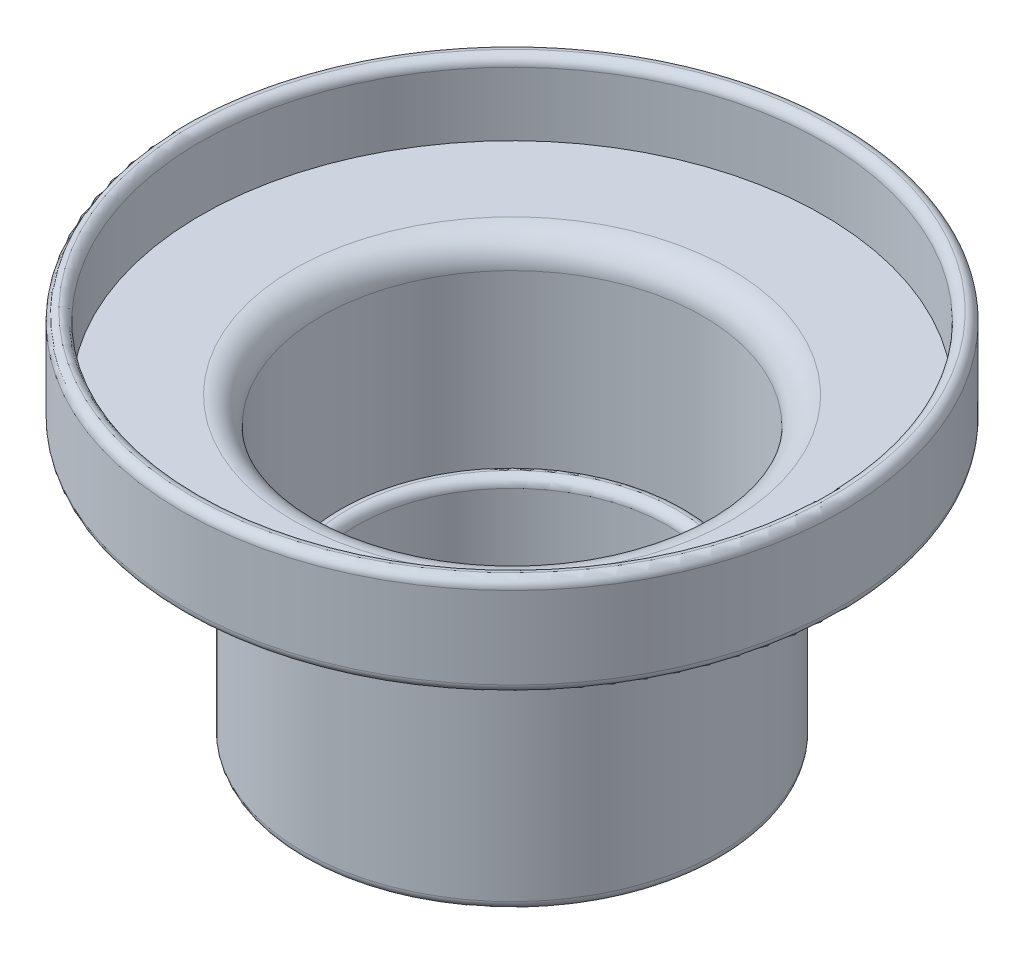
ISO-10303-21;
HEADER;
FILE_DESCRIPTION(('STEP AP214'),'2;1');
FILE_NAME('part.step','',(''),(''),'','','');
FILE_SCHEMA(('AUTOMOTIVE_DESIGN { 1 0 10303 214 1 1 1 1 }'));
ENDSEC;
DATA;
#1=APPLICATION_CONTEXT('core data for automotive mechanical design processes');
#2=APPLICATION_PROTOCOL_DEFINITION('international standard','automotive_design',2000,#1);
#3=PRODUCT_CONTEXT('',#1,'mechanical');
#4=PRODUCT('Part','Part','',(#3));
#5=PRODUCT_RELATED_PRODUCT_CATEGORY('part','',(#4));
#6=PRODUCT_DEFINITION_FORMATION('','',#4);
#7=PRODUCT_DEFINITION_CONTEXT('part definition',#1,'design');
#8=PRODUCT_DEFINITION('design','',#6,#7);
#9=PRODUCT_DEFINITION_SHAPE('','',#8);
#10=(LENGTH_UNIT() NAMED_UNIT(*) SI_UNIT(.MILLI.,.METRE.));
#11=(NAMED_UNIT(*) PLANE_ANGLE_UNIT() SI_UNIT($,.RADIAN.));
#12=(NAMED_UNIT(*) SI_UNIT($,.STERADIAN.) SOLID_ANGLE_UNIT());
#13=UNCERTAINTY_MEASURE_WITH_UNIT(LENGTH_MEASURE(1.E-05),#10,'distance_accuracy_value','');
#14=(GEOMETRIC_REPRESENTATION_CONTEXT(3) GLOBAL_UNCERTAINTY_ASSIGNED_CONTEXT((#13)) GLOBAL_UNIT_ASSIGNED_CONTEXT((#10,
#11,#12)) REPRESENTATION_CONTEXT('',''));
#15=CARTESIAN_POINT('',(0.,0.,0.));
#16=DIRECTION('',(0.,0.,1.));
#17=DIRECTION('',(1.,0.,0.));
#18=AXIS2_PLACEMENT_3D('',#15,#16,#17);
#19=CARTESIAN_POINT('',(0.,-3.,0.));
#20=DIRECTION('',(0.,1.,0.));
#21=DIRECTION('',(0.,0.,1.));
#22=AXIS2_PLACEMENT_3D('',#19,#20,#21);
#23=CYLINDRICAL_SURFACE('',#22,23.);
#24=CARTESIAN_POINT('',(0.,-2.,0.));
#25=DIRECTION('',(0.,1.,0.));
#26=DIRECTION('',(0.,0.,1.));
#27=AXIS2_PLACEMENT_3D('',#24,#25,#26);
#28=CIRCLE('',#27,23.);
#29=CARTESIAN_POINT('',(0.,-2.,23.));
#30=VERTEX_POINT('',#29);
#31=EDGE_CURVE('E50',#30,#30,#28,.T.);
#32=ORIENTED_EDGE('',*,*,#31,.T.);
#33=EDGE_LOOP('',(#32));
#34=FACE_BOUND('',#33,.T.);
#35=CARTESIAN_POINT('',(0.,22.,0.));
#36=DIRECTION('',(0.,1.,0.));
#37=DIRECTION('',(0.,0.,1.));
#38=AXIS2_PLACEMENT_3D('',#35,#36,#37);
#39=CIRCLE('',#38,23.);
#40=CARTESIAN_POINT('',(0.,22.,23.));
#41=VERTEX_POINT('',#40);
#42=EDGE_CURVE('E157',#41,#41,#39,.F.);
#43=ORIENTED_EDGE('',*,*,#42,.T.);
#44=EDGE_LOOP('',(#43));
#45=FACE_BOUND('',#44,.T.);
#46=ADVANCED_FACE('F37',(#34,#45),#23,.T.);
#47=CARTESIAN_POINT('',(0.,0.,0.));
#48=DIRECTION('',(0.,1.,0.));
#49=DIRECTION('',(0.,0.,1.));
#50=AXIS2_PLACEMENT_3D('',#47,#48,#49);
#51=PLANE('',#50);
#52=CARTESIAN_POINT('',(0.,0.,0.));
#53=DIRECTION('',(0.,1.,0.));
#54=DIRECTION('',(0.,0.,1.));
#55=AXIS2_PLACEMENT_3D('',#52,#53,#54);
#56=CIRCLE('',#55,19.125);
#57=CARTESIAN_POINT('',(0.,0.,19.125));
#58=VERTEX_POINT('',#57);
#59=EDGE_CURVE('E55',#58,#58,#56,.T.);
#60=ORIENTED_EDGE('',*,*,#59,.F.);
#61=EDGE_LOOP('',(#60));
#62=FACE_BOUND('',#61,.T.);
#63=CARTESIAN_POINT('',(0.,0.,0.));
#64=DIRECTION('',(0.,1.,0.));
#65=DIRECTION('',(0.,0.,1.));
#66=AXIS2_PLACEMENT_3D('',#63,#64,#65);
#67=CIRCLE('',#66,21.);
#68=CARTESIAN_POINT('',(0.,0.,21.));
#69=VERTEX_POINT('',#68);
#70=EDGE_CURVE('E59',#69,#69,#67,.F.);
#71=ORIENTED_EDGE('',*,*,#70,.F.);
#72=EDGE_LOOP('',(#71));
#73=FACE_BOUND('',#72,.T.);
#74=ADVANCED_FACE('F78',(#62,#73),#51,.T.);
#75=CARTESIAN_POINT('',(0.,64.0936687607709,0.));
#76=DIRECTION('',(0.,-1.,0.));
#77=DIRECTION('',(0.,0.,-1.));
#78=AXIS2_PLACEMENT_3D('',#75,#76,#77);
#79=CYLINDRICAL_SURFACE('',#78,19.125);
#80=CARTESIAN_POINT('',(0.,9.,0.));
#81=DIRECTION('',(0.,1.,0.));
#82=DIRECTION('',(0.,0.,1.));
#83=AXIS2_PLACEMENT_3D('',#80,#81,#82);
#84=CIRCLE('',#83,19.125);
#85=CARTESIAN_POINT('',(0.,9.,19.125));
#86=VERTEX_POINT('',#85);
#87=EDGE_CURVE('E10',#86,#86,#84,.F.);
#88=ORIENTED_EDGE('',*,*,#87,.T.);
#89=EDGE_LOOP('',(#88));
#90=FACE_BOUND('',#89,.T.);
#91=ORIENTED_EDGE('',*,*,#59,.T.);
#92=EDGE_LOOP('',(#91));
#93=FACE_BOUND('',#92,.T.);
#94=ADVANCED_FACE('F84',(#90,#93),#79,.T.);
#95=CARTESIAN_POINT('',(0.,64.0936687607709,0.));
#96=DIRECTION('',(0.,-1.,0.));
#97=DIRECTION('',(0.,0.,-1.));
#98=AXIS2_PLACEMENT_3D('',#95,#96,#97);
#99=CYLINDRICAL_SURFACE('',#98,17.125);
#100=CARTESIAN_POINT('',(0.,-2.,0.));
#101=DIRECTION('',(0.,1.,0.));
#102=DIRECTION('',(0.,0.,1.));
#103=AXIS2_PLACEMENT_3D('',#100,#101,#102);
#104=CIRCLE('',#103,17.125);
#105=CARTESIAN_POINT('',(0.,-2.,17.125));
#106=VERTEX_POINT('',#105);
#107=EDGE_CURVE('E128',#106,#106,#104,.F.);
#108=ORIENTED_EDGE('',*,*,#107,.T.);
#109=EDGE_LOOP('',(#108));
#110=FACE_BOUND('',#109,.T.);
#111=CARTESIAN_POINT('',(0.,9.,0.));
#112=DIRECTION('',(0.,1.,0.));
#113=DIRECTION('',(0.,0.,1.));
#114=AXIS2_PLACEMENT_3D('',#111,#112,#113);
#115=CIRCLE('',#114,17.125);
#116=CARTESIAN_POINT('',(0.,9.,17.125));
#117=VERTEX_POINT('',#116);
#118=EDGE_CURVE('E130',#117,#117,#115,.T.);
#119=ORIENTED_EDGE('',*,*,#118,.T.);
#120=EDGE_LOOP('',(#119));
#121=FACE_BOUND('',#120,.T.);
#122=ADVANCED_FACE('F91',(#110,#121),#99,.F.);
#123=CARTESIAN_POINT('',(0.,-3.,0.));
#124=DIRECTION('',(0.,1.,0.));
#125=DIRECTION('',(0.,0.,1.));
#126=AXIS2_PLACEMENT_3D('',#123,#124,#125);
#127=PLANE('',#126);
#128=CARTESIAN_POINT('',(0.,-3.,0.));
#129=DIRECTION('',(0.,1.,0.));
#130=DIRECTION('',(0.,0.,1.));
#131=AXIS2_PLACEMENT_3D('',#128,#129,#130);
#132=CIRCLE('',#131,18.125);
#133=CARTESIAN_POINT('',(0.,-3.,18.125));
#134=VERTEX_POINT('',#133);
#135=EDGE_CURVE('E135',#134,#134,#132,.T.);
#136=ORIENTED_EDGE('',*,*,#135,.T.);
#137=EDGE_LOOP('',(#136));
#138=FACE_BOUND('',#137,.T.);
#139=CARTESIAN_POINT('',(0.,-3.,0.));
#140=DIRECTION('',(0.,1.,0.));
#141=DIRECTION('',(0.,0.,1.));
#142=AXIS2_PLACEMENT_3D('',#139,#140,#141);
#143=CIRCLE('',#142,22.);
#144=CARTESIAN_POINT('',(0.,-3.,22.));
#145=VERTEX_POINT('',#144);
#146=EDGE_CURVE('E126',#145,#145,#143,.F.);
#147=ORIENTED_EDGE('',*,*,#146,.T.);
#148=EDGE_LOOP('',(#147));
#149=FACE_BOUND('',#148,.T.);
#150=ADVANCED_FACE('F94',(#138,#149),#127,.F.);
#151=CARTESIAN_POINT('',(0.,95.0538238691624,0.));
#152=DIRECTION('',(0.,-1.,0.));
#153=DIRECTION('',(0.,0.,-1.));
#154=AXIS2_PLACEMENT_3D('',#151,#152,#153);
#155=CYLINDRICAL_SURFACE('',#154,21.);
#156=CARTESIAN_POINT('',(0.,27.,0.));
#157=DIRECTION('',(0.,1.,0.));
#158=DIRECTION('',(0.,0.,1.));
#159=AXIS2_PLACEMENT_3D('',#156,#157,#158);
#160=CIRCLE('',#159,21.);
#161=CARTESIAN_POINT('',(0.,27.,21.));
#162=VERTEX_POINT('',#161);
#163=EDGE_CURVE('E151',#162,#162,#160,.T.);
#164=ORIENTED_EDGE('',*,*,#163,.T.);
#165=EDGE_LOOP('',(#164));
#166=FACE_BOUND('',#165,.T.);
#167=ORIENTED_EDGE('',*,*,#70,.T.);
#168=EDGE_LOOP('',(#167));
#169=FACE_BOUND('',#168,.T.);
#170=ADVANCED_FACE('F166',(#166,#169),#155,.F.);
#171=CARTESIAN_POINT('',(0.,30.,0.));
#172=DIRECTION('',(0.,1.,0.));
#173=DIRECTION('',(0.,0.,1.));
#174=AXIS2_PLACEMENT_3D('',#171,#172,#173);
#175=PLANE('',#174);
#176=CARTESIAN_POINT('',(0.,30.,0.));
#177=DIRECTION('',(0.,1.,0.));
#178=DIRECTION('',(0.,0.,1.));
#179=AXIS2_PLACEMENT_3D('',#176,#177,#178);
#180=CIRCLE('',#179,24.);
#181=CARTESIAN_POINT('',(0.,30.,24.));
#182=VERTEX_POINT('',#181);
#183=EDGE_CURVE('E148',#182,#182,#180,.F.);
#184=ORIENTED_EDGE('',*,*,#183,.T.);
#185=EDGE_LOOP('',(#184));
#186=FACE_BOUND('',#185,.T.);
#187=CARTESIAN_POINT('',(0.,30.,0.));
#188=DIRECTION('',(0.,1.,0.));
#189=DIRECTION('',(0.,0.,1.));
#190=AXIS2_PLACEMENT_3D('',#187,#188,#189);
#191=CIRCLE('',#190,34.25);
#192=CARTESIAN_POINT('',(0.,30.,34.25));
#193=VERTEX_POINT('',#192);
#194=EDGE_CURVE('E160',#193,#193,#191,.F.);
#195=ORIENTED_EDGE('',*,*,#194,.F.);
#196=EDGE_LOOP('',(#195));
#197=FACE_BOUND('',#196,.T.);
#198=ADVANCED_FACE('F169',(#186,#197),#175,.T.);
#199=CARTESIAN_POINT('',(0.,27.,0.));
#200=DIRECTION('',(0.,1.,0.));
#201=DIRECTION('',(0.,0.,1.));
#202=AXIS2_PLACEMENT_3D('',#199,#200,#201);
#203=CYLINDRICAL_SURFACE('',#202,36.25);
#204=CARTESIAN_POINT('',(0.,37.,0.));
#205=DIRECTION('',(0.,1.,0.));
#206=DIRECTION('',(0.,0.,1.));
#207=AXIS2_PLACEMENT_3D('',#204,#205,#206);
#208=CIRCLE('',#207,36.25);
#209=CARTESIAN_POINT('',(0.,37.,36.25));
#210=VERTEX_POINT('',#209);
#211=EDGE_CURVE('E142',#210,#210,#208,.F.);
#212=ORIENTED_EDGE('',*,*,#211,.T.);
#213=EDGE_LOOP('',(#212));
#214=FACE_BOUND('',#213,.T.);
#215=CARTESIAN_POINT('',(0.,28.,0.));
#216=DIRECTION('',(0.,1.,0.));
#217=DIRECTION('',(0.,0.,1.));
#218=AXIS2_PLACEMENT_3D('',#215,#216,#217);
#219=CIRCLE('',#218,36.25);
#220=CARTESIAN_POINT('',(0.,28.,36.25));
#221=VERTEX_POINT('',#220);
#222=EDGE_CURVE('E145',#221,#221,#219,.T.);
#223=ORIENTED_EDGE('',*,*,#222,.T.);
#224=EDGE_LOOP('',(#223));
#225=FACE_BOUND('',#224,.T.);
#226=ADVANCED_FACE('F176',(#214,#225),#203,.T.);
#227=CARTESIAN_POINT('',(0.,27.,0.));
#228=DIRECTION('',(0.,1.,0.));
#229=DIRECTION('',(0.,0.,1.));
#230=AXIS2_PLACEMENT_3D('',#227,#228,#229);
#231=PLANE('',#230);
#232=CARTESIAN_POINT('',(0.,27.,0.));
#233=DIRECTION('',(0.,1.,0.));
#234=DIRECTION('',(0.,0.,1.));
#235=AXIS2_PLACEMENT_3D('',#232,#233,#234);
#236=CIRCLE('',#235,35.25);
#237=CARTESIAN_POINT('',(0.,27.,35.25));
#238=VERTEX_POINT('',#237);
#239=EDGE_CURVE('E45',#238,#238,#236,.F.);
#240=ORIENTED_EDGE('',*,*,#239,.T.);
#241=EDGE_LOOP('',(#240));
#242=FACE_BOUND('',#241,.T.);
#243=CARTESIAN_POINT('',(0.,27.,0.));
#244=DIRECTION('',(0.,1.,0.));
#245=DIRECTION('',(0.,0.,1.));
#246=AXIS2_PLACEMENT_3D('',#243,#244,#245);
#247=CIRCLE('',#246,28.);
#248=CARTESIAN_POINT('',(0.,27.,28.));
#249=VERTEX_POINT('',#248);
#250=EDGE_CURVE('E154',#249,#249,#247,.T.);
#251=ORIENTED_EDGE('',*,*,#250,.T.);
#252=EDGE_LOOP('',(#251));
#253=FACE_BOUND('',#252,.T.);
#254=ADVANCED_FACE('F183',(#242,#253),#231,.F.);
#255=CARTESIAN_POINT('',(0.,38.,0.));
#256=DIRECTION('',(0.,-1.,0.));
#257=DIRECTION('',(0.,0.,-1.));
#258=AXIS2_PLACEMENT_3D('',#255,#256,#257);
#259=CYLINDRICAL_SURFACE('',#258,34.25);
#260=CARTESIAN_POINT('',(0.,37.,0.));
#261=DIRECTION('',(0.,1.,0.));
#262=DIRECTION('',(0.,0.,1.));
#263=AXIS2_PLACEMENT_3D('',#260,#261,#262);
#264=CIRCLE('',#263,34.25);
#265=CARTESIAN_POINT('',(0.,37.,34.25));
#266=VERTEX_POINT('',#265);
#267=EDGE_CURVE('E139',#266,#266,#264,.T.);
#268=ORIENTED_EDGE('',*,*,#267,.T.);
#269=EDGE_LOOP('',(#268));
#270=FACE_BOUND('',#269,.T.);
#271=ORIENTED_EDGE('',*,*,#194,.T.);
#272=EDGE_LOOP('',(#271));
#273=FACE_BOUND('',#272,.T.);
#274=ADVANCED_FACE('F102',(#270,#273),#259,.F.);
#275=CARTESIAN_POINT('',(0.,22.,0.));
#276=DIRECTION('',(0.,1.,0.));
#277=DIRECTION('',(0.,0.,1.));
#278=AXIS2_PLACEMENT_3D('',#275,#276,#277);
#279=TOROIDAL_SURFACE('',#278,28.,5.);
#280=ORIENTED_EDGE('',*,*,#250,.F.);
#281=EDGE_LOOP('',(#280));
#282=FACE_BOUND('',#281,.T.);
#283=ORIENTED_EDGE('',*,*,#42,.F.);
#284=EDGE_LOOP('',(#283));
#285=FACE_BOUND('',#284,.T.);
#286=ADVANCED_FACE('F98',(#282,#285),#279,.F.);
#287=CARTESIAN_POINT('',(0.,27.,0.));
#288=DIRECTION('',(0.,1.,0.));
#289=DIRECTION('',(0.,0.,1.));
#290=AXIS2_PLACEMENT_3D('',#287,#288,#289);
#291=TOROIDAL_SURFACE('',#290,24.,3.);
#292=ORIENTED_EDGE('',*,*,#183,.F.);
#293=EDGE_LOOP('',(#292));
#294=FACE_BOUND('',#293,.T.);
#295=ORIENTED_EDGE('',*,*,#163,.F.);
#296=EDGE_LOOP('',(#295));
#297=FACE_BOUND('',#296,.T.);
#298=ADVANCED_FACE('F101',(#294,#297),#291,.T.);
#299=CARTESIAN_POINT('',(0.,37.,0.));
#300=DIRECTION('',(0.,1.,0.));
#301=DIRECTION('',(0.,0.,1.));
#302=AXIS2_PLACEMENT_3D('',#299,#300,#301);
#303=TOROIDAL_SURFACE('',#302,35.25,1.);
#304=ORIENTED_EDGE('',*,*,#267,.F.);
#305=EDGE_LOOP('',(#304));
#306=FACE_BOUND('',#305,.T.);
#307=CARTESIAN_POINT('',(0.,38.,0.));
#308=DIRECTION('',(0.,1.,0.));
#309=DIRECTION('',(0.,0.,1.));
#310=AXIS2_PLACEMENT_3D('',#307,#308,#309);
#311=CIRCLE('',#310,35.25);
#312=CARTESIAN_POINT('',(0.,38.,35.25));
#313=VERTEX_POINT('',#312);
#314=EDGE_CURVE('E53',#313,#313,#311,.F.);
#315=ORIENTED_EDGE('',*,*,#314,.F.);
#316=EDGE_LOOP('',(#315));
#317=FACE_BOUND('',#316,.T.);
#318=ADVANCED_FACE('F106',(#306,#317),#303,.T.);
#319=CARTESIAN_POINT('',(0.,37.,0.));
#320=DIRECTION('',(0.,1.,0.));
#321=DIRECTION('',(0.,0.,1.));
#322=AXIS2_PLACEMENT_3D('',#319,#320,#321);
#323=TOROIDAL_SURFACE('',#322,35.25,1.);
#324=ORIENTED_EDGE('',*,*,#211,.F.);
#325=EDGE_LOOP('',(#324));
#326=FACE_BOUND('',#325,.T.);
#327=ORIENTED_EDGE('',*,*,#314,.T.);
#328=EDGE_LOOP('',(#327));
#329=FACE_BOUND('',#328,.T.);
#330=ADVANCED_FACE('F108',(#326,#329),#323,.T.);
#331=CARTESIAN_POINT('',(0.,-2.,0.));
#332=DIRECTION('',(0.,1.,0.));
#333=DIRECTION('',(0.,0.,1.));
#334=AXIS2_PLACEMENT_3D('',#331,#332,#333);
#335=TOROIDAL_SURFACE('',#334,18.125,1.);
#336=ORIENTED_EDGE('',*,*,#107,.F.);
#337=EDGE_LOOP('',(#336));
#338=FACE_BOUND('',#337,.T.);
#339=ORIENTED_EDGE('',*,*,#135,.F.);
#340=EDGE_LOOP('',(#339));
#341=FACE_BOUND('',#340,.T.);
#342=ADVANCED_FACE('F111',(#338,#341),#335,.T.);
#343=CARTESIAN_POINT('',(0.,-2.,0.));
#344=DIRECTION('',(0.,1.,0.));
#345=DIRECTION('',(0.,0.,1.));
#346=AXIS2_PLACEMENT_3D('',#343,#344,#345);
#347=TOROIDAL_SURFACE('',#346,22.,1.);
#348=ORIENTED_EDGE('',*,*,#146,.F.);
#349=EDGE_LOOP('',(#348));
#350=FACE_BOUND('',#349,.T.);
#351=ORIENTED_EDGE('',*,*,#31,.F.);
#352=EDGE_LOOP('',(#351));
#353=FACE_BOUND('',#352,.T.);
#354=ADVANCED_FACE('F74',(#350,#353),#347,.T.);
#355=CARTESIAN_POINT('',(0.,28.,0.));
#356=DIRECTION('',(0.,1.,0.));
#357=DIRECTION('',(0.,0.,1.));
#358=AXIS2_PLACEMENT_3D('',#355,#356,#357);
#359=TOROIDAL_SURFACE('',#358,35.25,1.);
#360=ORIENTED_EDGE('',*,*,#239,.F.);
#361=EDGE_LOOP('',(#360));
#362=FACE_BOUND('',#361,.T.);
#363=ORIENTED_EDGE('',*,*,#222,.F.);
#364=EDGE_LOOP('',(#363));
#365=FACE_BOUND('',#364,.T.);
#366=ADVANCED_FACE('F68',(#362,#365),#359,.T.);
#367=CARTESIAN_POINT('',(0.,9.,0.));
#368=DIRECTION('',(0.,1.,0.));
#369=DIRECTION('',(0.,0.,1.));
#370=AXIS2_PLACEMENT_3D('',#367,#368,#369);
#371=TOROIDAL_SURFACE('',#370,18.125,1.);
#372=ORIENTED_EDGE('',*,*,#87,.F.);
#373=EDGE_LOOP('',(#372));
#374=FACE_BOUND('',#373,.T.);
#375=CARTESIAN_POINT('',(0.,10.,0.));
#376=DIRECTION('',(0.,1.,0.));
#377=DIRECTION('',(0.,0.,1.));
#378=AXIS2_PLACEMENT_3D('',#375,#376,#377);
#379=CIRCLE('',#378,18.125);
#380=CARTESIAN_POINT('',(0.,10.,18.125));
#381=VERTEX_POINT('',#380);
#382=EDGE_CURVE('E41',#381,#381,#379,.T.);
#383=ORIENTED_EDGE('',*,*,#382,.F.);
#384=EDGE_LOOP('',(#383));
#385=FACE_BOUND('',#384,.T.);
#386=ADVANCED_FACE('F39',(#374,#385),#371,.T.);
#387=CARTESIAN_POINT('',(0.,9.,0.));
#388=DIRECTION('',(0.,1.,0.));
#389=DIRECTION('',(0.,0.,1.));
#390=AXIS2_PLACEMENT_3D('',#387,#388,#389);
#391=TOROIDAL_SURFACE('',#390,18.125,1.);
#392=ORIENTED_EDGE('',*,*,#382,.T.);
#393=EDGE_LOOP('',(#392));
#394=FACE_BOUND('',#393,.T.);
#395=ORIENTED_EDGE('',*,*,#118,.F.);
#396=EDGE_LOOP('',(#395));
#397=FACE_BOUND('',#396,.T.);
#398=ADVANCED_FACE('F64',(#394,#397),#391,.T.);
#399=CLOSED_SHELL('',(#46,#74,#94,#122,#150,#170,#198,#226,#254,#274,#286,#298,#318,#330,#342,
#354,#366,#386,#398));
#400=MANIFOLD_SOLID_BREP('B2',#399);
#401=ADVANCED_BREP_SHAPE_REPRESENTATION('',(#18,#400),#14);
#402=SHAPE_DEFINITION_REPRESENTATION(#9,#401);
ENDSEC;
END-ISO-10303-21;
